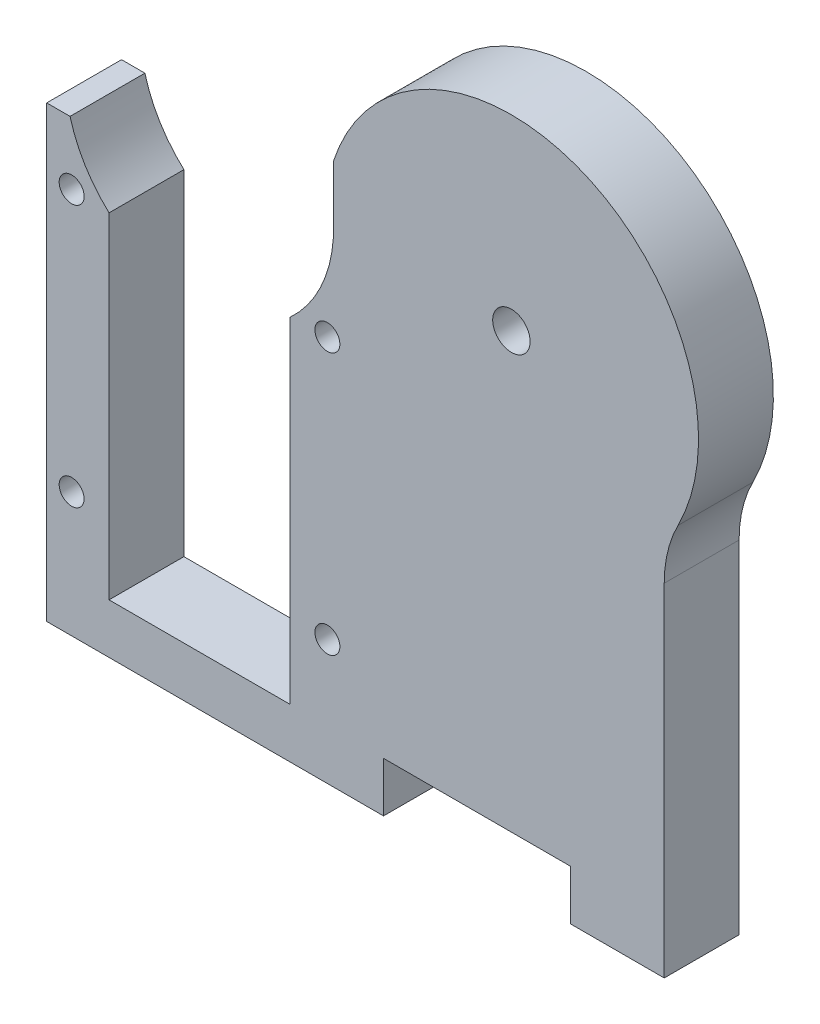
ISO-10303-21;
HEADER;
FILE_DESCRIPTION(('STEP AP214'),'2;1');
FILE_NAME('part.step','',(''),(''),'','','');
FILE_SCHEMA(('AUTOMOTIVE_DESIGN { 1 0 10303 214 1 1 1 1 }'));
ENDSEC;
DATA;
#1=APPLICATION_CONTEXT('core data for automotive mechanical design processes');
#2=APPLICATION_PROTOCOL_DEFINITION('international standard','automotive_design',2000,#1);
#3=PRODUCT_CONTEXT('',#1,'mechanical');
#4=PRODUCT('Part','Part','',(#3));
#5=PRODUCT_RELATED_PRODUCT_CATEGORY('part','',(#4));
#6=PRODUCT_DEFINITION_FORMATION('','',#4);
#7=PRODUCT_DEFINITION_CONTEXT('part definition',#1,'design');
#8=PRODUCT_DEFINITION('design','',#6,#7);
#9=PRODUCT_DEFINITION_SHAPE('','',#8);
#10=(LENGTH_UNIT() NAMED_UNIT(*) SI_UNIT(.MILLI.,.METRE.));
#11=(NAMED_UNIT(*) PLANE_ANGLE_UNIT() SI_UNIT($,.RADIAN.));
#12=(NAMED_UNIT(*) SI_UNIT($,.STERADIAN.) SOLID_ANGLE_UNIT());
#13=UNCERTAINTY_MEASURE_WITH_UNIT(LENGTH_MEASURE(1.E-05),#10,'distance_accuracy_value','');
#14=(GEOMETRIC_REPRESENTATION_CONTEXT(3) GLOBAL_UNCERTAINTY_ASSIGNED_CONTEXT((#13)) GLOBAL_UNIT_ASSIGNED_CONTEXT((#10,
#11,#12)) REPRESENTATION_CONTEXT('',''));
#15=CARTESIAN_POINT('',(0.,0.,0.));
#16=DIRECTION('',(0.,0.,1.));
#17=DIRECTION('',(1.,0.,0.));
#18=AXIS2_PLACEMENT_3D('',#15,#16,#17);
#19=CARTESIAN_POINT('',(0.,-4.,6.));
#20=DIRECTION('',(0.,1.,0.));
#21=DIRECTION('',(-1.,0.,0.));
#22=AXIS2_PLACEMENT_3D('',#19,#20,#21);
#23=PLANE('',#22);
#24=DIRECTION('',(1.,0.,0.));
#25=VECTOR('',#24,1.);
#26=CARTESIAN_POINT('',(0.,-4.,0.));
#27=LINE('',#26,#25);
#28=CARTESIAN_POINT('',(0.,-4.,0.));
#29=VERTEX_POINT('',#28);
#30=CARTESIAN_POINT('',(27.,-4.,0.));
#31=VERTEX_POINT('',#30);
#32=EDGE_CURVE('E183',#29,#31,#27,.T.);
#33=ORIENTED_EDGE('',*,*,#32,.T.);
#34=DIRECTION('',(0.,0.,1.));
#35=VECTOR('',#34,1.);
#36=CARTESIAN_POINT('',(27.,-4.,6.));
#37=LINE('',#36,#35);
#38=CARTESIAN_POINT('',(27.,-4.,6.));
#39=VERTEX_POINT('',#38);
#40=EDGE_CURVE('E48',#31,#39,#37,.T.);
#41=ORIENTED_EDGE('',*,*,#40,.T.);
#42=DIRECTION('',(1.,0.,0.));
#43=VECTOR('',#42,1.);
#44=CARTESIAN_POINT('',(0.,-4.,6.));
#45=LINE('',#44,#43);
#46=CARTESIAN_POINT('',(0.,-4.,6.));
#47=VERTEX_POINT('',#46);
#48=EDGE_CURVE('E119',#47,#39,#45,.T.);
#49=ORIENTED_EDGE('',*,*,#48,.F.);
#50=DIRECTION('',(0.,0.,-1.));
#51=VECTOR('',#50,1.);
#52=CARTESIAN_POINT('',(0.,-4.,6.));
#53=LINE('',#52,#51);
#54=EDGE_CURVE('E253',#47,#29,#53,.T.);
#55=ORIENTED_EDGE('',*,*,#54,.T.);
#56=EDGE_LOOP('',(#33,#41,#49,#55));
#57=FACE_BOUND('',#56,.T.);
#58=ADVANCED_FACE('F39',(#57),#23,.F.);
#59=CARTESIAN_POINT('',(59.5,23.4049961652275,6.));
#60=DIRECTION('',(0.,0.,-1.));
#61=DIRECTION('',(-1.,0.,0.));
#62=AXIS2_PLACEMENT_3D('',#59,#60,#61);
#63=PLANE('',#62);
#64=ORIENTED_EDGE('',*,*,#48,.T.);
#65=DIRECTION('',(0.,-1.,0.));
#66=VECTOR('',#65,1.);
#67=CARTESIAN_POINT('',(27.,-4.,6.));
#68=LINE('',#67,#66);
#69=CARTESIAN_POINT('',(27.,0.,6.));
#70=VERTEX_POINT('',#69);
#71=EDGE_CURVE('E271',#70,#39,#68,.T.);
#72=ORIENTED_EDGE('',*,*,#71,.F.);
#73=DIRECTION('',(-1.,0.,0.));
#74=VECTOR('',#73,1.);
#75=CARTESIAN_POINT('',(27.,0.,6.));
#76=LINE('',#75,#74);
#77=CARTESIAN_POINT('',(42.,0.,6.));
#78=VERTEX_POINT('',#77);
#79=EDGE_CURVE('E406',#78,#70,#76,.T.);
#80=ORIENTED_EDGE('',*,*,#79,.F.);
#81=DIRECTION('',(0.,1.,0.));
#82=VECTOR('',#81,1.);
#83=CARTESIAN_POINT('',(42.,-4.,6.));
#84=LINE('',#83,#82);
#85=CARTESIAN_POINT('',(42.,-4.,6.));
#86=VERTEX_POINT('',#85);
#87=EDGE_CURVE('E404',#86,#78,#84,.T.);
#88=ORIENTED_EDGE('',*,*,#87,.F.);
#89=CARTESIAN_POINT('',(49.5,-3.99999999999999,6.));
#90=VERTEX_POINT('',#89);
#91=EDGE_CURVE('E274',#86,#90,#45,.T.);
#92=ORIENTED_EDGE('',*,*,#91,.T.);
#93=DIRECTION('',(0.,1.,0.));
#94=VECTOR('',#93,1.);
#95=CARTESIAN_POINT('',(49.5,-3.99999999999999,6.));
#96=LINE('',#95,#94);
#97=CARTESIAN_POINT('',(49.5,23.4049961652275,6.));
#98=VERTEX_POINT('',#97);
#99=EDGE_CURVE('E273',#90,#98,#96,.T.);
#100=ORIENTED_EDGE('',*,*,#99,.T.);
#101=CARTESIAN_POINT('',(59.5,23.4049961652275,6.));
#102=DIRECTION('',(0.,0.,-1.));
#103=DIRECTION('',(-1.,0.,0.));
#104=AXIS2_PLACEMENT_3D('',#101,#102,#103);
#105=CIRCLE('',#104,10.);
#106=CARTESIAN_POINT('',(50.6,27.9646014112986,6.));
#107=VERTEX_POINT('',#106);
#108=EDGE_CURVE('E278',#98,#107,#105,.T.);
#109=ORIENTED_EDGE('',*,*,#108,.T.);
#110=CARTESIAN_POINT('',(37.25,34.8040092804054,6.));
#111=DIRECTION('',(0.,0.,1.));
#112=DIRECTION('',(1.,0.,0.));
#113=AXIS2_PLACEMENT_3D('',#110,#111,#112);
#114=CIRCLE('',#113,15.);
#115=CARTESIAN_POINT('',(22.9954794787238,39.4739819471902,6.));
#116=VERTEX_POINT('',#115);
#117=EDGE_CURVE('E285',#107,#116,#114,.T.);
#118=ORIENTED_EDGE('',*,*,#117,.T.);
#119=DIRECTION('',(0.,-1.,0.));
#120=VECTOR('',#119,1.);
#121=CARTESIAN_POINT('',(22.9954794787238,35.1157315483375,6.));
#122=LINE('',#121,#120);
#123=CARTESIAN_POINT('',(22.9954794787238,35.1157315483375,6.));
#124=VERTEX_POINT('',#123);
#125=EDGE_CURVE('E288',#116,#124,#122,.T.);
#126=ORIENTED_EDGE('',*,*,#125,.T.);
#127=CARTESIAN_POINT('',(12.25,34.8040092804054,6.));
#128=DIRECTION('',(0.,0.,-1.));
#129=DIRECTION('',(1.,0.,0.));
#130=AXIS2_PLACEMENT_3D('',#127,#128,#129);
#131=CIRCLE('',#130,10.75);
#132=CARTESIAN_POINT('',(19.5,26.8667553472116,6.));
#133=VERTEX_POINT('',#132);
#134=EDGE_CURVE('E291',#124,#133,#131,.T.);
#135=ORIENTED_EDGE('',*,*,#134,.T.);
#136=DIRECTION('',(0.,-1.,0.));
#137=VECTOR('',#136,1.);
#138=CARTESIAN_POINT('',(19.5,0.,6.));
#139=LINE('',#138,#137);
#140=CARTESIAN_POINT('',(19.5,0.,6.));
#141=VERTEX_POINT('',#140);
#142=EDGE_CURVE('E294',#133,#141,#139,.T.);
#143=ORIENTED_EDGE('',*,*,#142,.T.);
#144=DIRECTION('',(-1.,0.,0.));
#145=VECTOR('',#144,1.);
#146=CARTESIAN_POINT('',(5.,0.,6.));
#147=LINE('',#146,#145);
#148=CARTESIAN_POINT('',(5.,0.,6.));
#149=VERTEX_POINT('',#148);
#150=EDGE_CURVE('E156',#141,#149,#147,.T.);
#151=ORIENTED_EDGE('',*,*,#150,.T.);
#152=DIRECTION('',(0.,1.,0.));
#153=VECTOR('',#152,1.);
#154=CARTESIAN_POINT('',(5.,0.,6.));
#155=LINE('',#154,#153);
#156=CARTESIAN_POINT('',(5.,26.8667553472117,6.));
#157=VERTEX_POINT('',#156);
#158=EDGE_CURVE('E148',#149,#157,#155,.T.);
#159=ORIENTED_EDGE('',*,*,#158,.T.);
#160=CARTESIAN_POINT('',(12.25,34.8040092804054,6.));
#161=DIRECTION('',(0.,0.,-1.));
#162=DIRECTION('',(1.,0.,0.));
#163=AXIS2_PLACEMENT_3D('',#160,#161,#162);
#164=CIRCLE('',#163,10.75);
#165=CARTESIAN_POINT('',(1.8721374091097,32.,6.));
#166=VERTEX_POINT('',#165);
#167=EDGE_CURVE('E153',#157,#166,#164,.T.);
#168=ORIENTED_EDGE('',*,*,#167,.T.);
#169=DIRECTION('',(-1.,0.,0.));
#170=VECTOR('',#169,1.);
#171=CARTESIAN_POINT('',(1.8721374091097,32.,6.));
#172=LINE('',#171,#170);
#173=CARTESIAN_POINT('',(0.,32.,6.));
#174=VERTEX_POINT('',#173);
#175=EDGE_CURVE('E176',#166,#174,#172,.T.);
#176=ORIENTED_EDGE('',*,*,#175,.T.);
#177=DIRECTION('',(0.,-1.,0.));
#178=VECTOR('',#177,1.);
#179=CARTESIAN_POINT('',(0.,0.,6.));
#180=LINE('',#179,#178);
#181=EDGE_CURVE('E64',#174,#47,#180,.T.);
#182=ORIENTED_EDGE('',*,*,#181,.T.);
#183=EDGE_LOOP('',(#64,#72,#80,#88,#92,#100,#109,#118,#126,#135,#143,#151,#159,#168,#176,#182));
#184=FACE_BOUND('',#183,.T.);
#185=CARTESIAN_POINT('',(2.,27.,6.));
#186=DIRECTION('',(0.,0.,1.));
#187=DIRECTION('',(1.,0.,0.));
#188=AXIS2_PLACEMENT_3D('',#185,#186,#187);
#189=CIRCLE('',#188,1.);
#190=CARTESIAN_POINT('',(3.,27.,6.));
#191=VERTEX_POINT('',#190);
#192=EDGE_CURVE('E358',#191,#191,#189,.T.);
#193=ORIENTED_EDGE('',*,*,#192,.F.);
#194=EDGE_LOOP('',(#193));
#195=FACE_BOUND('',#194,.T.);
#196=CARTESIAN_POINT('',(22.5,27.,6.));
#197=DIRECTION('',(0.,0.,1.));
#198=DIRECTION('',(-1.,0.,0.));
#199=AXIS2_PLACEMENT_3D('',#196,#197,#198);
#200=CIRCLE('',#199,1.);
#201=CARTESIAN_POINT('',(21.5,27.,6.));
#202=VERTEX_POINT('',#201);
#203=EDGE_CURVE('E350',#202,#202,#200,.T.);
#204=ORIENTED_EDGE('',*,*,#203,.F.);
#205=EDGE_LOOP('',(#204));
#206=FACE_BOUND('',#205,.T.);
#207=CARTESIAN_POINT('',(22.5,6.,6.));
#208=DIRECTION('',(0.,0.,1.));
#209=DIRECTION('',(1.,0.,0.));
#210=AXIS2_PLACEMENT_3D('',#207,#208,#209);
#211=CIRCLE('',#210,1.);
#212=CARTESIAN_POINT('',(23.5,6.,6.));
#213=VERTEX_POINT('',#212);
#214=EDGE_CURVE('E342',#213,#213,#211,.T.);
#215=ORIENTED_EDGE('',*,*,#214,.F.);
#216=EDGE_LOOP('',(#215));
#217=FACE_BOUND('',#216,.T.);
#218=CARTESIAN_POINT('',(2.,6.,6.));
#219=DIRECTION('',(0.,0.,1.));
#220=DIRECTION('',(-1.,0.,0.));
#221=AXIS2_PLACEMENT_3D('',#218,#219,#220);
#222=CIRCLE('',#221,1.);
#223=CARTESIAN_POINT('',(1.,6.,6.));
#224=VERTEX_POINT('',#223);
#225=EDGE_CURVE('E334',#224,#224,#222,.T.);
#226=ORIENTED_EDGE('',*,*,#225,.F.);
#227=EDGE_LOOP('',(#226));
#228=FACE_BOUND('',#227,.T.);
#229=CARTESIAN_POINT('',(37.25,34.8040092804054,6.));
#230=DIRECTION('',(0.,0.,1.));
#231=DIRECTION('',(1.,0.,0.));
#232=AXIS2_PLACEMENT_3D('',#229,#230,#231);
#233=CIRCLE('',#232,1.5);
#234=CARTESIAN_POINT('',(38.75,34.8040092804054,6.));
#235=VERTEX_POINT('',#234);
#236=EDGE_CURVE('E324',#235,#235,#233,.T.);
#237=ORIENTED_EDGE('',*,*,#236,.F.);
#238=EDGE_LOOP('',(#237));
#239=FACE_BOUND('',#238,.T.);
#240=ADVANCED_FACE('F150',(#184,#195,#206,#217,#228,#239),#63,.F.);
#241=CARTESIAN_POINT('',(59.5,23.4049961652275,0.));
#242=DIRECTION('',(0.,0.,-1.));
#243=DIRECTION('',(-1.,0.,0.));
#244=AXIS2_PLACEMENT_3D('',#241,#242,#243);
#245=PLANE('',#244);
#246=DIRECTION('',(0.,1.,0.));
#247=VECTOR('',#246,1.);
#248=CARTESIAN_POINT('',(27.,23.4049961652275,0.));
#249=LINE('',#248,#247);
#250=CARTESIAN_POINT('',(27.,0.,0.));
#251=VERTEX_POINT('',#250);
#252=EDGE_CURVE('E314',#31,#251,#249,.T.);
#253=ORIENTED_EDGE('',*,*,#252,.F.);
#254=ORIENTED_EDGE('',*,*,#32,.F.);
#255=DIRECTION('',(0.,-1.,0.));
#256=VECTOR('',#255,1.);
#257=CARTESIAN_POINT('',(0.,0.,0.));
#258=LINE('',#257,#256);
#259=CARTESIAN_POINT('',(0.,32.,0.));
#260=VERTEX_POINT('',#259);
#261=EDGE_CURVE('E216',#260,#29,#258,.T.);
#262=ORIENTED_EDGE('',*,*,#261,.F.);
#263=DIRECTION('',(-1.,0.,0.));
#264=VECTOR('',#263,1.);
#265=CARTESIAN_POINT('',(1.8721374091097,32.,0.));
#266=LINE('',#265,#264);
#267=CARTESIAN_POINT('',(1.8721374091097,32.,0.));
#268=VERTEX_POINT('',#267);
#269=EDGE_CURVE('E111',#268,#260,#266,.T.);
#270=ORIENTED_EDGE('',*,*,#269,.F.);
#271=CARTESIAN_POINT('',(12.25,34.8040092804054,0.));
#272=DIRECTION('',(0.,0.,-1.));
#273=DIRECTION('',(1.,0.,0.));
#274=AXIS2_PLACEMENT_3D('',#271,#272,#273);
#275=CIRCLE('',#274,10.75);
#276=CARTESIAN_POINT('',(5.,26.8667553472117,0.));
#277=VERTEX_POINT('',#276);
#278=EDGE_CURVE('E211',#277,#268,#275,.T.);
#279=ORIENTED_EDGE('',*,*,#278,.F.);
#280=DIRECTION('',(0.,1.,0.));
#281=VECTOR('',#280,1.);
#282=CARTESIAN_POINT('',(5.,0.,0.));
#283=LINE('',#282,#281);
#284=CARTESIAN_POINT('',(5.,0.,0.));
#285=VERTEX_POINT('',#284);
#286=EDGE_CURVE('E166',#285,#277,#283,.T.);
#287=ORIENTED_EDGE('',*,*,#286,.F.);
#288=DIRECTION('',(-1.,0.,0.));
#289=VECTOR('',#288,1.);
#290=CARTESIAN_POINT('',(5.,0.,0.));
#291=LINE('',#290,#289);
#292=CARTESIAN_POINT('',(19.5,0.,0.));
#293=VERTEX_POINT('',#292);
#294=EDGE_CURVE('E206',#293,#285,#291,.T.);
#295=ORIENTED_EDGE('',*,*,#294,.F.);
#296=DIRECTION('',(0.,-1.,0.));
#297=VECTOR('',#296,1.);
#298=CARTESIAN_POINT('',(19.5,0.,0.));
#299=LINE('',#298,#297);
#300=CARTESIAN_POINT('',(19.5,26.8667553472116,0.));
#301=VERTEX_POINT('',#300);
#302=EDGE_CURVE('E203',#301,#293,#299,.T.);
#303=ORIENTED_EDGE('',*,*,#302,.F.);
#304=CARTESIAN_POINT('',(12.25,34.8040092804054,0.));
#305=DIRECTION('',(0.,0.,-1.));
#306=DIRECTION('',(1.,0.,0.));
#307=AXIS2_PLACEMENT_3D('',#304,#305,#306);
#308=CIRCLE('',#307,10.75);
#309=CARTESIAN_POINT('',(22.9954794787238,35.1157315483375,0.));
#310=VERTEX_POINT('',#309);
#311=EDGE_CURVE('E200',#310,#301,#308,.T.);
#312=ORIENTED_EDGE('',*,*,#311,.F.);
#313=DIRECTION('',(0.,-1.,0.));
#314=VECTOR('',#313,1.);
#315=CARTESIAN_POINT('',(22.9954794787238,35.1157315483375,0.));
#316=LINE('',#315,#314);
#317=CARTESIAN_POINT('',(22.9954794787238,39.4739819471902,0.));
#318=VERTEX_POINT('',#317);
#319=EDGE_CURVE('E197',#318,#310,#316,.T.);
#320=ORIENTED_EDGE('',*,*,#319,.F.);
#321=CARTESIAN_POINT('',(37.25,34.8040092804054,0.));
#322=DIRECTION('',(0.,0.,1.));
#323=DIRECTION('',(1.,0.,0.));
#324=AXIS2_PLACEMENT_3D('',#321,#322,#323);
#325=CIRCLE('',#324,15.);
#326=CARTESIAN_POINT('',(50.6,27.9646014112986,0.));
#327=VERTEX_POINT('',#326);
#328=EDGE_CURVE('E194',#327,#318,#325,.T.);
#329=ORIENTED_EDGE('',*,*,#328,.F.);
#330=CARTESIAN_POINT('',(59.5,23.4049961652275,0.));
#331=DIRECTION('',(0.,0.,-1.));
#332=DIRECTION('',(-1.,0.,0.));
#333=AXIS2_PLACEMENT_3D('',#330,#331,#332);
#334=CIRCLE('',#333,10.);
#335=CARTESIAN_POINT('',(49.5,23.4049961652275,0.));
#336=VERTEX_POINT('',#335);
#337=EDGE_CURVE('E191',#336,#327,#334,.T.);
#338=ORIENTED_EDGE('',*,*,#337,.F.);
#339=DIRECTION('',(0.,1.,0.));
#340=VECTOR('',#339,1.);
#341=CARTESIAN_POINT('',(49.5,-3.99999999999999,0.));
#342=LINE('',#341,#340);
#343=CARTESIAN_POINT('',(49.5,-3.99999999999999,0.));
#344=VERTEX_POINT('',#343);
#345=EDGE_CURVE('E187',#344,#336,#342,.T.);
#346=ORIENTED_EDGE('',*,*,#345,.F.);
#347=CARTESIAN_POINT('',(42.,-3.99999999999999,0.));
#348=VERTEX_POINT('',#347);
#349=EDGE_CURVE('E188',#348,#344,#27,.T.);
#350=ORIENTED_EDGE('',*,*,#349,.F.);
#351=DIRECTION('',(0.,-1.,0.));
#352=VECTOR('',#351,1.);
#353=CARTESIAN_POINT('',(42.,23.4049961652275,0.));
#354=LINE('',#353,#352);
#355=CARTESIAN_POINT('',(42.,0.,0.));
#356=VERTEX_POINT('',#355);
#357=EDGE_CURVE('E55',#356,#348,#354,.T.);
#358=ORIENTED_EDGE('',*,*,#357,.F.);
#359=DIRECTION('',(1.,0.,0.));
#360=VECTOR('',#359,1.);
#361=CARTESIAN_POINT('',(59.5,0.,0.));
#362=LINE('',#361,#360);
#363=EDGE_CURVE('E11',#251,#356,#362,.T.);
#364=ORIENTED_EDGE('',*,*,#363,.F.);
#365=EDGE_LOOP('',(#253,#254,#262,#270,#279,#287,#295,#303,#312,#320,#329,#338,#346,#350,#358,#364));
#366=FACE_BOUND('',#365,.T.);
#367=CARTESIAN_POINT('',(2.,6.,0.));
#368=DIRECTION('',(0.,0.,1.));
#369=DIRECTION('',(-1.,0.,0.));
#370=AXIS2_PLACEMENT_3D('',#367,#368,#369);
#371=CIRCLE('',#370,1.);
#372=CARTESIAN_POINT('',(1.,6.,0.));
#373=VERTEX_POINT('',#372);
#374=EDGE_CURVE('E332',#373,#373,#371,.T.);
#375=ORIENTED_EDGE('',*,*,#374,.T.);
#376=EDGE_LOOP('',(#375));
#377=FACE_BOUND('',#376,.T.);
#378=CARTESIAN_POINT('',(22.5,27.,0.));
#379=DIRECTION('',(0.,0.,1.));
#380=DIRECTION('',(-1.,0.,0.));
#381=AXIS2_PLACEMENT_3D('',#378,#379,#380);
#382=CIRCLE('',#381,1.);
#383=CARTESIAN_POINT('',(21.5,27.,0.));
#384=VERTEX_POINT('',#383);
#385=EDGE_CURVE('E346',#384,#384,#382,.T.);
#386=ORIENTED_EDGE('',*,*,#385,.T.);
#387=EDGE_LOOP('',(#386));
#388=FACE_BOUND('',#387,.T.);
#389=CARTESIAN_POINT('',(2.,27.,0.));
#390=DIRECTION('',(0.,0.,1.));
#391=DIRECTION('',(1.,0.,0.));
#392=AXIS2_PLACEMENT_3D('',#389,#390,#391);
#393=CIRCLE('',#392,1.);
#394=CARTESIAN_POINT('',(3.,27.,0.));
#395=VERTEX_POINT('',#394);
#396=EDGE_CURVE('E354',#395,#395,#393,.T.);
#397=ORIENTED_EDGE('',*,*,#396,.T.);
#398=EDGE_LOOP('',(#397));
#399=FACE_BOUND('',#398,.T.);
#400=CARTESIAN_POINT('',(22.5,6.,0.));
#401=DIRECTION('',(0.,0.,1.));
#402=DIRECTION('',(1.,0.,0.));
#403=AXIS2_PLACEMENT_3D('',#400,#401,#402);
#404=CIRCLE('',#403,1.);
#405=CARTESIAN_POINT('',(23.5,6.,0.));
#406=VERTEX_POINT('',#405);
#407=EDGE_CURVE('E338',#406,#406,#404,.T.);
#408=ORIENTED_EDGE('',*,*,#407,.T.);
#409=EDGE_LOOP('',(#408));
#410=FACE_BOUND('',#409,.T.);
#411=CARTESIAN_POINT('',(37.25,34.8040092804054,0.));
#412=DIRECTION('',(0.,0.,1.));
#413=DIRECTION('',(1.,0.,0.));
#414=AXIS2_PLACEMENT_3D('',#411,#412,#413);
#415=CIRCLE('',#414,1.5);
#416=CARTESIAN_POINT('',(38.75,34.8040092804054,0.));
#417=VERTEX_POINT('',#416);
#418=EDGE_CURVE('E319',#417,#417,#415,.T.);
#419=ORIENTED_EDGE('',*,*,#418,.T.);
#420=EDGE_LOOP('',(#419));
#421=FACE_BOUND('',#420,.T.);
#422=ADVANCED_FACE('F308',(#366,#377,#388,#399,#410,#421),#245,.T.);
#423=ORIENTED_EDGE('',*,*,#91,.F.);
#424=DIRECTION('',(0.,0.,-1.));
#425=VECTOR('',#424,1.);
#426=CARTESIAN_POINT('',(42.,-3.99999999999999,6.));
#427=LINE('',#426,#425);
#428=EDGE_CURVE('E256',#86,#348,#427,.T.);
#429=ORIENTED_EDGE('',*,*,#428,.T.);
#430=ORIENTED_EDGE('',*,*,#349,.T.);
#431=DIRECTION('',(0.,0.,-1.));
#432=VECTOR('',#431,1.);
#433=CARTESIAN_POINT('',(49.5,-3.99999999999999,6.));
#434=LINE('',#433,#432);
#435=EDGE_CURVE('E249',#90,#344,#434,.T.);
#436=ORIENTED_EDGE('',*,*,#435,.F.);
#437=EDGE_LOOP('',(#423,#429,#430,#436));
#438=FACE_BOUND('',#437,.T.);
#439=ADVANCED_FACE('F41',(#438),#23,.F.);
#440=CARTESIAN_POINT('',(49.5,-3.99999999999999,6.));
#441=DIRECTION('',(-1.,0.,0.));
#442=DIRECTION('',(0.,0.,1.));
#443=AXIS2_PLACEMENT_3D('',#440,#441,#442);
#444=PLANE('',#443);
#445=ORIENTED_EDGE('',*,*,#345,.T.);
#446=DIRECTION('',(0.,0.,-1.));
#447=VECTOR('',#446,1.);
#448=CARTESIAN_POINT('',(49.5,23.4049961652275,6.));
#449=LINE('',#448,#447);
#450=EDGE_CURVE('E245',#98,#336,#449,.T.);
#451=ORIENTED_EDGE('',*,*,#450,.F.);
#452=ORIENTED_EDGE('',*,*,#99,.F.);
#453=ORIENTED_EDGE('',*,*,#435,.T.);
#454=EDGE_LOOP('',(#445,#451,#452,#453));
#455=FACE_BOUND('',#454,.T.);
#456=ADVANCED_FACE('F386',(#455),#444,.F.);
#457=CARTESIAN_POINT('',(59.5,23.4049961652275,6.));
#458=DIRECTION('',(0.,0.,-1.));
#459=DIRECTION('',(-1.,0.,0.));
#460=AXIS2_PLACEMENT_3D('',#457,#458,#459);
#461=CYLINDRICAL_SURFACE('',#460,10.);
#462=ORIENTED_EDGE('',*,*,#337,.T.);
#463=DIRECTION('',(0.,0.,-1.));
#464=VECTOR('',#463,1.);
#465=CARTESIAN_POINT('',(50.6,27.9646014112986,6.));
#466=LINE('',#465,#464);
#467=EDGE_CURVE('E241',#107,#327,#466,.T.);
#468=ORIENTED_EDGE('',*,*,#467,.F.);
#469=ORIENTED_EDGE('',*,*,#108,.F.);
#470=ORIENTED_EDGE('',*,*,#450,.T.);
#471=EDGE_LOOP('',(#462,#468,#469,#470));
#472=FACE_BOUND('',#471,.T.);
#473=ADVANCED_FACE('F392',(#472),#461,.F.);
#474=CARTESIAN_POINT('',(37.25,34.8040092804054,6.));
#475=DIRECTION('',(0.,0.,-1.));
#476=DIRECTION('',(-1.,0.,0.));
#477=AXIS2_PLACEMENT_3D('',#474,#475,#476);
#478=CYLINDRICAL_SURFACE('',#477,15.);
#479=ORIENTED_EDGE('',*,*,#328,.T.);
#480=DIRECTION('',(0.,0.,-1.));
#481=VECTOR('',#480,1.);
#482=CARTESIAN_POINT('',(22.9954794787238,39.4739819471902,6.));
#483=LINE('',#482,#481);
#484=EDGE_CURVE('E237',#116,#318,#483,.T.);
#485=ORIENTED_EDGE('',*,*,#484,.F.);
#486=ORIENTED_EDGE('',*,*,#117,.F.);
#487=ORIENTED_EDGE('',*,*,#467,.T.);
#488=EDGE_LOOP('',(#479,#485,#486,#487));
#489=FACE_BOUND('',#488,.T.);
#490=ADVANCED_FACE('F436',(#489),#478,.T.);
#491=CARTESIAN_POINT('',(22.9954794787238,35.1157315483375,6.));
#492=DIRECTION('',(1.,0.,0.));
#493=DIRECTION('',(0.,1.,0.));
#494=AXIS2_PLACEMENT_3D('',#491,#492,#493);
#495=PLANE('',#494);
#496=ORIENTED_EDGE('',*,*,#319,.T.);
#497=DIRECTION('',(0.,0.,-1.));
#498=VECTOR('',#497,1.);
#499=CARTESIAN_POINT('',(22.9954794787238,35.1157315483375,6.));
#500=LINE('',#499,#498);
#501=EDGE_CURVE('E233',#124,#310,#500,.T.);
#502=ORIENTED_EDGE('',*,*,#501,.F.);
#503=ORIENTED_EDGE('',*,*,#125,.F.);
#504=ORIENTED_EDGE('',*,*,#484,.T.);
#505=EDGE_LOOP('',(#496,#502,#503,#504));
#506=FACE_BOUND('',#505,.T.);
#507=ADVANCED_FACE('F440',(#506),#495,.F.);
#508=CARTESIAN_POINT('',(12.25,34.8040092804054,6.));
#509=DIRECTION('',(0.,0.,-1.));
#510=DIRECTION('',(-1.,0.,0.));
#511=AXIS2_PLACEMENT_3D('',#508,#509,#510);
#512=CYLINDRICAL_SURFACE('',#511,10.75);
#513=ORIENTED_EDGE('',*,*,#311,.T.);
#514=DIRECTION('',(0.,0.,-1.));
#515=VECTOR('',#514,1.);
#516=CARTESIAN_POINT('',(19.5,26.8667553472116,6.));
#517=LINE('',#516,#515);
#518=EDGE_CURVE('E229',#133,#301,#517,.T.);
#519=ORIENTED_EDGE('',*,*,#518,.F.);
#520=ORIENTED_EDGE('',*,*,#134,.F.);
#521=ORIENTED_EDGE('',*,*,#501,.T.);
#522=EDGE_LOOP('',(#513,#519,#520,#521));
#523=FACE_BOUND('',#522,.T.);
#524=ADVANCED_FACE('F443',(#523),#512,.F.);
#525=CARTESIAN_POINT('',(19.5,0.,6.));
#526=DIRECTION('',(1.,0.,0.));
#527=DIRECTION('',(0.,0.,-1.));
#528=AXIS2_PLACEMENT_3D('',#525,#526,#527);
#529=PLANE('',#528);
#530=ORIENTED_EDGE('',*,*,#302,.T.);
#531=DIRECTION('',(0.,0.,-1.));
#532=VECTOR('',#531,1.);
#533=CARTESIAN_POINT('',(19.5,0.,6.));
#534=LINE('',#533,#532);
#535=EDGE_CURVE('E225',#141,#293,#534,.T.);
#536=ORIENTED_EDGE('',*,*,#535,.F.);
#537=ORIENTED_EDGE('',*,*,#142,.F.);
#538=ORIENTED_EDGE('',*,*,#518,.T.);
#539=EDGE_LOOP('',(#530,#536,#537,#538));
#540=FACE_BOUND('',#539,.T.);
#541=ADVANCED_FACE('F302',(#540),#529,.F.);
#542=CARTESIAN_POINT('',(5.,0.,6.));
#543=DIRECTION('',(0.,-1.,0.));
#544=DIRECTION('',(0.,0.,-1.));
#545=AXIS2_PLACEMENT_3D('',#542,#543,#544);
#546=PLANE('',#545);
#547=ORIENTED_EDGE('',*,*,#294,.T.);
#548=DIRECTION('',(0.,0.,-1.));
#549=VECTOR('',#548,1.);
#550=CARTESIAN_POINT('',(5.,0.,6.));
#551=LINE('',#550,#549);
#552=EDGE_CURVE('E170',#149,#285,#551,.T.);
#553=ORIENTED_EDGE('',*,*,#552,.F.);
#554=ORIENTED_EDGE('',*,*,#150,.F.);
#555=ORIENTED_EDGE('',*,*,#535,.T.);
#556=EDGE_LOOP('',(#547,#553,#554,#555));
#557=FACE_BOUND('',#556,.T.);
#558=ADVANCED_FACE('F306',(#557),#546,.F.);
#559=CARTESIAN_POINT('',(5.,0.,6.));
#560=DIRECTION('',(-1.,0.,0.));
#561=DIRECTION('',(0.,0.,1.));
#562=AXIS2_PLACEMENT_3D('',#559,#560,#561);
#563=PLANE('',#562);
#564=ORIENTED_EDGE('',*,*,#286,.T.);
#565=DIRECTION('',(0.,0.,-1.));
#566=VECTOR('',#565,1.);
#567=CARTESIAN_POINT('',(5.,26.8667553472117,6.));
#568=LINE('',#567,#566);
#569=EDGE_CURVE('E163',#157,#277,#568,.T.);
#570=ORIENTED_EDGE('',*,*,#569,.F.);
#571=ORIENTED_EDGE('',*,*,#158,.F.);
#572=ORIENTED_EDGE('',*,*,#552,.T.);
#573=EDGE_LOOP('',(#564,#570,#571,#572));
#574=FACE_BOUND('',#573,.T.);
#575=ADVANCED_FACE('F164',(#574),#563,.F.);
#576=CARTESIAN_POINT('',(12.25,34.8040092804054,6.));
#577=DIRECTION('',(0.,0.,-1.));
#578=DIRECTION('',(-1.,0.,0.));
#579=AXIS2_PLACEMENT_3D('',#576,#577,#578);
#580=CYLINDRICAL_SURFACE('',#579,10.75);
#581=ORIENTED_EDGE('',*,*,#278,.T.);
#582=DIRECTION('',(0.,0.,-1.));
#583=VECTOR('',#582,1.);
#584=CARTESIAN_POINT('',(1.8721374091097,32.,6.));
#585=LINE('',#584,#583);
#586=EDGE_CURVE('E171',#166,#268,#585,.T.);
#587=ORIENTED_EDGE('',*,*,#586,.F.);
#588=ORIENTED_EDGE('',*,*,#167,.F.);
#589=ORIENTED_EDGE('',*,*,#569,.T.);
#590=EDGE_LOOP('',(#581,#587,#588,#589));
#591=FACE_BOUND('',#590,.T.);
#592=ADVANCED_FACE('F173',(#591),#580,.F.);
#593=CARTESIAN_POINT('',(1.8721374091097,32.,6.));
#594=DIRECTION('',(0.,-1.,0.));
#595=DIRECTION('',(0.,0.,-1.));
#596=AXIS2_PLACEMENT_3D('',#593,#594,#595);
#597=PLANE('',#596);
#598=ORIENTED_EDGE('',*,*,#269,.T.);
#599=DIRECTION('',(0.,0.,-1.));
#600=VECTOR('',#599,1.);
#601=CARTESIAN_POINT('',(0.,32.,6.));
#602=LINE('',#601,#600);
#603=EDGE_CURVE('E179',#174,#260,#602,.T.);
#604=ORIENTED_EDGE('',*,*,#603,.F.);
#605=ORIENTED_EDGE('',*,*,#175,.F.);
#606=ORIENTED_EDGE('',*,*,#586,.T.);
#607=EDGE_LOOP('',(#598,#604,#605,#606));
#608=FACE_BOUND('',#607,.T.);
#609=ADVANCED_FACE('F311',(#608),#597,.F.);
#610=CARTESIAN_POINT('',(0.,0.,6.));
#611=DIRECTION('',(1.,0.,0.));
#612=DIRECTION('',(0.,0.,-1.));
#613=AXIS2_PLACEMENT_3D('',#610,#611,#612);
#614=PLANE('',#613);
#615=ORIENTED_EDGE('',*,*,#261,.T.);
#616=ORIENTED_EDGE('',*,*,#54,.F.);
#617=ORIENTED_EDGE('',*,*,#181,.F.);
#618=ORIENTED_EDGE('',*,*,#603,.T.);
#619=EDGE_LOOP('',(#615,#616,#617,#618));
#620=FACE_BOUND('',#619,.T.);
#621=ADVANCED_FACE('F312',(#620),#614,.F.);
#622=CARTESIAN_POINT('',(2.,27.,6.));
#623=DIRECTION('',(0.,0.,-1.));
#624=DIRECTION('',(-1.,0.,0.));
#625=AXIS2_PLACEMENT_3D('',#622,#623,#624);
#626=CYLINDRICAL_SURFACE('',#625,1.);
#627=ORIENTED_EDGE('',*,*,#192,.T.);
#628=EDGE_LOOP('',(#627));
#629=FACE_BOUND('',#628,.T.);
#630=ORIENTED_EDGE('',*,*,#396,.F.);
#631=EDGE_LOOP('',(#630));
#632=FACE_BOUND('',#631,.T.);
#633=ADVANCED_FACE('F367',(#629,#632),#626,.F.);
#634=CARTESIAN_POINT('',(22.5,27.,6.));
#635=DIRECTION('',(0.,0.,-1.));
#636=DIRECTION('',(-1.,0.,0.));
#637=AXIS2_PLACEMENT_3D('',#634,#635,#636);
#638=CYLINDRICAL_SURFACE('',#637,1.);
#639=ORIENTED_EDGE('',*,*,#203,.T.);
#640=EDGE_LOOP('',(#639));
#641=FACE_BOUND('',#640,.T.);
#642=ORIENTED_EDGE('',*,*,#385,.F.);
#643=EDGE_LOOP('',(#642));
#644=FACE_BOUND('',#643,.T.);
#645=ADVANCED_FACE('F369',(#641,#644),#638,.F.);
#646=CARTESIAN_POINT('',(22.5,6.,6.));
#647=DIRECTION('',(0.,0.,-1.));
#648=DIRECTION('',(-1.,0.,0.));
#649=AXIS2_PLACEMENT_3D('',#646,#647,#648);
#650=CYLINDRICAL_SURFACE('',#649,1.);
#651=ORIENTED_EDGE('',*,*,#214,.T.);
#652=EDGE_LOOP('',(#651));
#653=FACE_BOUND('',#652,.T.);
#654=ORIENTED_EDGE('',*,*,#407,.F.);
#655=EDGE_LOOP('',(#654));
#656=FACE_BOUND('',#655,.T.);
#657=ADVANCED_FACE('F376',(#653,#656),#650,.F.);
#658=CARTESIAN_POINT('',(2.,6.,6.));
#659=DIRECTION('',(0.,0.,-1.));
#660=DIRECTION('',(-1.,0.,0.));
#661=AXIS2_PLACEMENT_3D('',#658,#659,#660);
#662=CYLINDRICAL_SURFACE('',#661,1.);
#663=ORIENTED_EDGE('',*,*,#225,.T.);
#664=EDGE_LOOP('',(#663));
#665=FACE_BOUND('',#664,.T.);
#666=ORIENTED_EDGE('',*,*,#374,.F.);
#667=EDGE_LOOP('',(#666));
#668=FACE_BOUND('',#667,.T.);
#669=ADVANCED_FACE('F536',(#665,#668),#662,.F.);
#670=CARTESIAN_POINT('',(37.25,34.8040092804054,6.));
#671=DIRECTION('',(0.,0.,-1.));
#672=DIRECTION('',(-1.,0.,0.));
#673=AXIS2_PLACEMENT_3D('',#670,#671,#672);
#674=CYLINDRICAL_SURFACE('',#673,1.5);
#675=ORIENTED_EDGE('',*,*,#236,.T.);
#676=EDGE_LOOP('',(#675));
#677=FACE_BOUND('',#676,.T.);
#678=ORIENTED_EDGE('',*,*,#418,.F.);
#679=EDGE_LOOP('',(#678));
#680=FACE_BOUND('',#679,.T.);
#681=ADVANCED_FACE('F546',(#677,#680),#674,.F.);
#682=CARTESIAN_POINT('',(27.,-4.,-4.));
#683=DIRECTION('',(-1.,0.,0.));
#684=DIRECTION('',(0.,0.,1.));
#685=AXIS2_PLACEMENT_3D('',#682,#683,#684);
#686=PLANE('',#685);
#687=ORIENTED_EDGE('',*,*,#252,.T.);
#688=DIRECTION('',(0.,0.,1.));
#689=VECTOR('',#688,1.);
#690=CARTESIAN_POINT('',(27.,0.,-4.));
#691=LINE('',#690,#689);
#692=EDGE_CURVE('E326',#251,#70,#691,.T.);
#693=ORIENTED_EDGE('',*,*,#692,.T.);
#694=ORIENTED_EDGE('',*,*,#71,.T.);
#695=ORIENTED_EDGE('',*,*,#40,.F.);
#696=EDGE_LOOP('',(#687,#693,#694,#695));
#697=FACE_BOUND('',#696,.T.);
#698=ADVANCED_FACE('F555',(#697),#686,.F.);
#699=CARTESIAN_POINT('',(27.,0.,-4.));
#700=DIRECTION('',(0.,1.,0.));
#701=DIRECTION('',(0.,0.,1.));
#702=AXIS2_PLACEMENT_3D('',#699,#700,#701);
#703=PLANE('',#702);
#704=ORIENTED_EDGE('',*,*,#363,.T.);
#705=DIRECTION('',(0.,0.,1.));
#706=VECTOR('',#705,1.);
#707=CARTESIAN_POINT('',(42.,0.,-4.));
#708=LINE('',#707,#706);
#709=EDGE_CURVE('E411',#356,#78,#708,.T.);
#710=ORIENTED_EDGE('',*,*,#709,.T.);
#711=ORIENTED_EDGE('',*,*,#79,.T.);
#712=ORIENTED_EDGE('',*,*,#692,.F.);
#713=EDGE_LOOP('',(#704,#710,#711,#712));
#714=FACE_BOUND('',#713,.T.);
#715=ADVANCED_FACE('F419',(#714),#703,.F.);
#716=CARTESIAN_POINT('',(42.,-4.,-4.));
#717=DIRECTION('',(1.,0.,0.));
#718=DIRECTION('',(0.,0.,-1.));
#719=AXIS2_PLACEMENT_3D('',#716,#717,#718);
#720=PLANE('',#719);
#721=ORIENTED_EDGE('',*,*,#357,.T.);
#722=ORIENTED_EDGE('',*,*,#428,.F.);
#723=ORIENTED_EDGE('',*,*,#87,.T.);
#724=ORIENTED_EDGE('',*,*,#709,.F.);
#725=EDGE_LOOP('',(#721,#722,#723,#724));
#726=FACE_BOUND('',#725,.T.);
#727=ADVANCED_FACE('F422',(#726),#720,.F.);
#728=CLOSED_SHELL('',(#58,#240,#422,#439,#456,#473,#490,#507,#524,#541,#558,#575,#592,#609,#621,
#633,#645,#657,#669,#681,#698,#715,#727));
#729=MANIFOLD_SOLID_BREP('B2',#728);
#730=ADVANCED_BREP_SHAPE_REPRESENTATION('',(#18,#729),#14);
#731=SHAPE_DEFINITION_REPRESENTATION(#9,#730);
ENDSEC;
END-ISO-10303-21;
